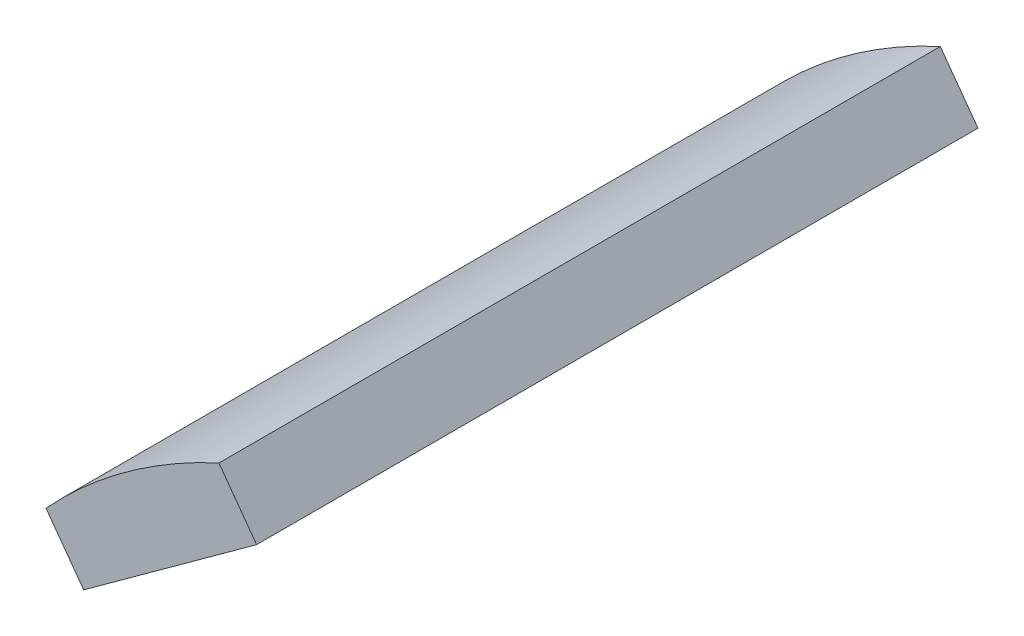
ISO-10303-21;
HEADER;
FILE_DESCRIPTION(('STEP AP214'),'2;1');
FILE_NAME('part.step','',(''),(''),'','','');
FILE_SCHEMA(('AUTOMOTIVE_DESIGN { 1 0 10303 214 1 1 1 1 }'));
ENDSEC;
DATA;
#1=APPLICATION_CONTEXT('core data for automotive mechanical design processes');
#2=APPLICATION_PROTOCOL_DEFINITION('international standard','automotive_design',2000,#1);
#3=PRODUCT_CONTEXT('',#1,'mechanical');
#4=PRODUCT('Part','Part','',(#3));
#5=PRODUCT_RELATED_PRODUCT_CATEGORY('part','',(#4));
#6=PRODUCT_DEFINITION_FORMATION('','',#4);
#7=PRODUCT_DEFINITION_CONTEXT('part definition',#1,'design');
#8=PRODUCT_DEFINITION('design','',#6,#7);
#9=PRODUCT_DEFINITION_SHAPE('','',#8);
#10=(LENGTH_UNIT() NAMED_UNIT(*) SI_UNIT(.MILLI.,.METRE.));
#11=(NAMED_UNIT(*) PLANE_ANGLE_UNIT() SI_UNIT($,.RADIAN.));
#12=(NAMED_UNIT(*) SI_UNIT($,.STERADIAN.) SOLID_ANGLE_UNIT());
#13=UNCERTAINTY_MEASURE_WITH_UNIT(LENGTH_MEASURE(1.E-05),#10,'distance_accuracy_value','');
#14=(GEOMETRIC_REPRESENTATION_CONTEXT(3) GLOBAL_UNCERTAINTY_ASSIGNED_CONTEXT((#13)) GLOBAL_UNIT_ASSIGNED_CONTEXT((#10,
#11,#12)) REPRESENTATION_CONTEXT('',''));
#15=CARTESIAN_POINT('',(0.,0.,0.));
#16=DIRECTION('',(0.,0.,1.));
#17=DIRECTION('',(1.,0.,0.));
#18=AXIS2_PLACEMENT_3D('',#15,#16,#17);
#19=CARTESIAN_POINT('',(8.09016994374947,5.87785252292455,67.5));
#20=DIRECTION('',(-0.809016994374956,-0.587785252292461,0.));
#21=DIRECTION('',(0.587785252292461,-0.809016994374956,0.));
#22=AXIS2_PLACEMENT_3D('',#19,#20,#21);
#23=PLANE('',#22);
#24=DIRECTION('',(-0.587785252292461,0.809016994374956,0.));
#25=VECTOR('',#24,1.);
#26=CARTESIAN_POINT('',(8.09016994374947,5.87785252292455,0.));
#27=LINE('',#26,#25);
#28=CARTESIAN_POINT('',(-39.8143281180861,71.8127375644835,0.));
#29=VERTEX_POINT('',#28);
#30=CARTESIAN_POINT('',(-43.3410396318409,76.6668395307332,0.));
#31=VERTEX_POINT('',#30);
#32=EDGE_CURVE('E109',#29,#31,#27,.T.);
#33=ORIENTED_EDGE('',*,*,#32,.T.);
#34=DIRECTION('',(0.,0.,-1.));
#35=VECTOR('',#34,1.);
#36=CARTESIAN_POINT('',(-43.3410396318409,76.6668395307332,67.5));
#37=LINE('',#36,#35);
#38=CARTESIAN_POINT('',(-43.3410396318409,76.6668395307332,67.5));
#39=VERTEX_POINT('',#38);
#40=EDGE_CURVE('E11',#39,#31,#37,.T.);
#41=ORIENTED_EDGE('',*,*,#40,.F.);
#42=DIRECTION('',(-0.587785252292461,0.809016994374956,0.));
#43=VECTOR('',#42,1.);
#44=CARTESIAN_POINT('',(8.09016994374947,5.87785252292455,67.5));
#45=LINE('',#44,#43);
#46=CARTESIAN_POINT('',(-39.8143281180861,71.8127375644835,67.5));
#47=VERTEX_POINT('',#46);
#48=EDGE_CURVE('E91',#47,#39,#45,.T.);
#49=ORIENTED_EDGE('',*,*,#48,.F.);
#50=DIRECTION('',(0.,0.,-1.));
#51=VECTOR('',#50,1.);
#52=CARTESIAN_POINT('',(-39.8143281180861,71.8127375644835,67.5));
#53=LINE('',#52,#51);
#54=EDGE_CURVE('E58',#47,#29,#53,.T.);
#55=ORIENTED_EDGE('',*,*,#54,.T.);
#56=EDGE_LOOP('',(#33,#41,#49,#55));
#57=FACE_BOUND('',#56,.T.);
#58=ADVANCED_FACE('F41',(#57),#23,.F.);
#59=CARTESIAN_POINT('',(-22.3358395871136,30.7426457862483,67.5));
#60=DIRECTION('',(0.,0.,-1.));
#61=DIRECTION('',(-1.,0.,0.));
#62=AXIS2_PLACEMENT_3D('',#59,#60,#61);
#63=CYLINDRICAL_SURFACE('',#62,50.5);
#64=CARTESIAN_POINT('',(-22.3358395871136,30.7426457862483,0.));
#65=DIRECTION('',(0.,0.,1.));
#66=DIRECTION('',(1.,0.,0.));
#67=AXIS2_PLACEMENT_3D('',#64,#65,#66);
#68=CIRCLE('',#67,50.5);
#69=CARTESIAN_POINT('',(-59.52137951934,64.911134484884,0.));
#70=VERTEX_POINT('',#69);
#71=EDGE_CURVE('E97',#31,#70,#68,.T.);
#72=ORIENTED_EDGE('',*,*,#71,.T.);
#73=DIRECTION('',(0.,0.,-1.));
#74=VECTOR('',#73,1.);
#75=CARTESIAN_POINT('',(-59.52137951934,64.911134484884,67.5));
#76=LINE('',#75,#74);
#77=CARTESIAN_POINT('',(-59.52137951934,64.911134484884,67.5));
#78=VERTEX_POINT('',#77);
#79=EDGE_CURVE('E50',#78,#70,#76,.T.);
#80=ORIENTED_EDGE('',*,*,#79,.F.);
#81=CARTESIAN_POINT('',(-22.3358395871136,30.7426457862483,67.5));
#82=DIRECTION('',(0.,0.,1.));
#83=DIRECTION('',(1.,0.,0.));
#84=AXIS2_PLACEMENT_3D('',#81,#82,#83);
#85=CIRCLE('',#84,50.5);
#86=EDGE_CURVE('E83',#39,#78,#85,.T.);
#87=ORIENTED_EDGE('',*,*,#86,.F.);
#88=ORIENTED_EDGE('',*,*,#40,.T.);
#89=EDGE_LOOP('',(#72,#80,#87,#88));
#90=FACE_BOUND('',#89,.T.);
#91=ADVANCED_FACE('F96',(#90),#63,.T.);
#92=CARTESIAN_POINT('',(-8.09016994374964,-5.87785252292468,67.5));
#93=DIRECTION('',(-0.809016994374956,-0.587785252292461,0.));
#94=DIRECTION('',(0.587785252292461,-0.809016994374956,0.));
#95=AXIS2_PLACEMENT_3D('',#92,#93,#94);
#96=PLANE('',#95);
#97=DIRECTION('',(-0.587785252292461,0.809016994374956,0.));
#98=VECTOR('',#97,1.);
#99=CARTESIAN_POINT('',(-8.09016994374964,-5.87785252292468,0.));
#100=LINE('',#99,#98);
#101=CARTESIAN_POINT('',(-55.9946680055852,60.0570325186342,0.));
#102=VERTEX_POINT('',#101);
#103=EDGE_CURVE('E114',#102,#70,#100,.T.);
#104=ORIENTED_EDGE('',*,*,#103,.F.);
#105=DIRECTION('',(0.,0.,-1.));
#106=VECTOR('',#105,1.);
#107=CARTESIAN_POINT('',(-55.9946680055852,60.0570325186342,67.5));
#108=LINE('',#107,#106);
#109=CARTESIAN_POINT('',(-55.9946680055852,60.0570325186342,67.5));
#110=VERTEX_POINT('',#109);
#111=EDGE_CURVE('E72',#110,#102,#108,.T.);
#112=ORIENTED_EDGE('',*,*,#111,.F.);
#113=DIRECTION('',(-0.587785252292461,0.809016994374956,0.));
#114=VECTOR('',#113,1.);
#115=CARTESIAN_POINT('',(-8.09016994374964,-5.87785252292468,67.5));
#116=LINE('',#115,#114);
#117=EDGE_CURVE('E90',#110,#78,#116,.T.);
#118=ORIENTED_EDGE('',*,*,#117,.T.);
#119=ORIENTED_EDGE('',*,*,#79,.T.);
#120=EDGE_LOOP('',(#104,#112,#118,#119));
#121=FACE_BOUND('',#120,.T.);
#122=ADVANCED_FACE('F101',(#121),#96,.T.);
#123=CARTESIAN_POINT('',(-47.9044980618357,65.9348850415589,67.5));
#124=DIRECTION('',(0.587785252292462,-0.809016994374955,0.));
#125=DIRECTION('',(0.809016994374955,0.587785252292462,0.));
#126=AXIS2_PLACEMENT_3D('',#123,#124,#125);
#127=PLANE('',#126);
#128=DIRECTION('',(-0.809016994374955,-0.587785252292462,0.));
#129=VECTOR('',#128,1.);
#130=CARTESIAN_POINT('',(-47.9044980618357,65.9348850415589,0.));
#131=LINE('',#130,#129);
#132=EDGE_CURVE('E117',#29,#102,#131,.T.);
#133=ORIENTED_EDGE('',*,*,#132,.F.);
#134=ORIENTED_EDGE('',*,*,#54,.F.);
#135=DIRECTION('',(-0.809016994374955,-0.587785252292462,0.));
#136=VECTOR('',#135,1.);
#137=CARTESIAN_POINT('',(-47.9044980618357,65.9348850415589,67.5));
#138=LINE('',#137,#136);
#139=EDGE_CURVE('E103',#47,#110,#138,.T.);
#140=ORIENTED_EDGE('',*,*,#139,.T.);
#141=ORIENTED_EDGE('',*,*,#111,.T.);
#142=EDGE_LOOP('',(#133,#134,#140,#141));
#143=FACE_BOUND('',#142,.T.);
#144=ADVANCED_FACE('F127',(#143),#127,.T.);
#145=CARTESIAN_POINT('',(0.,0.,67.5));
#146=DIRECTION('',(0.,0.,1.));
#147=DIRECTION('',(1.,0.,0.));
#148=AXIS2_PLACEMENT_3D('',#145,#146,#147);
#149=PLANE('',#148);
#150=ORIENTED_EDGE('',*,*,#48,.T.);
#151=ORIENTED_EDGE('',*,*,#86,.T.);
#152=ORIENTED_EDGE('',*,*,#117,.F.);
#153=ORIENTED_EDGE('',*,*,#139,.F.);
#154=EDGE_LOOP('',(#150,#151,#152,#153));
#155=FACE_BOUND('',#154,.T.);
#156=ADVANCED_FACE('F87',(#155),#149,.T.);
#157=CARTESIAN_POINT('',(0.,0.,0.));
#158=DIRECTION('',(0.,0.,1.));
#159=DIRECTION('',(1.,0.,0.));
#160=AXIS2_PLACEMENT_3D('',#157,#158,#159);
#161=PLANE('',#160);
#162=ORIENTED_EDGE('',*,*,#32,.F.);
#163=ORIENTED_EDGE('',*,*,#132,.T.);
#164=ORIENTED_EDGE('',*,*,#103,.T.);
#165=ORIENTED_EDGE('',*,*,#71,.F.);
#166=EDGE_LOOP('',(#162,#163,#164,#165));
#167=FACE_BOUND('',#166,.T.);
#168=ADVANCED_FACE('F126',(#167),#161,.F.);
#169=CLOSED_SHELL('',(#58,#91,#122,#144,#156,#168));
#170=MANIFOLD_SOLID_BREP('B2',#169);
#171=ADVANCED_BREP_SHAPE_REPRESENTATION('',(#18,#170),#14);
#172=SHAPE_DEFINITION_REPRESENTATION(#9,#171);
ENDSEC;
END-ISO-10303-21;
